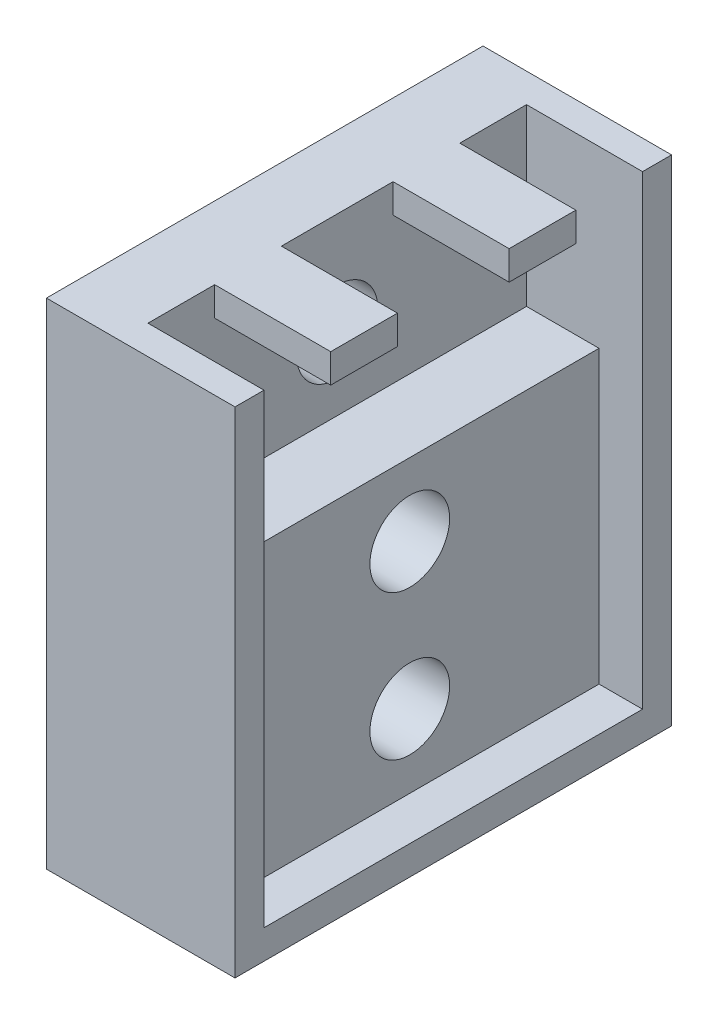
ISO-10303-21;
HEADER;
FILE_DESCRIPTION(('STEP AP214'),'2;1');
FILE_NAME('part.step','',(''),(''),'','','');
FILE_SCHEMA(('AUTOMOTIVE_DESIGN { 1 0 10303 214 1 1 1 1 }'));
ENDSEC;
DATA;
#1=APPLICATION_CONTEXT('core data for automotive mechanical design processes');
#2=APPLICATION_PROTOCOL_DEFINITION('international standard','automotive_design',2000,#1);
#3=PRODUCT_CONTEXT('',#1,'mechanical');
#4=PRODUCT('Part','Part','',(#3));
#5=PRODUCT_RELATED_PRODUCT_CATEGORY('part','',(#4));
#6=PRODUCT_DEFINITION_FORMATION('','',#4);
#7=PRODUCT_DEFINITION_CONTEXT('part definition',#1,'design');
#8=PRODUCT_DEFINITION('design','',#6,#7);
#9=PRODUCT_DEFINITION_SHAPE('','',#8);
#10=(LENGTH_UNIT() NAMED_UNIT(*) SI_UNIT(.MILLI.,.METRE.));
#11=(NAMED_UNIT(*) PLANE_ANGLE_UNIT() SI_UNIT($,.RADIAN.));
#12=(NAMED_UNIT(*) SI_UNIT($,.STERADIAN.) SOLID_ANGLE_UNIT());
#13=UNCERTAINTY_MEASURE_WITH_UNIT(LENGTH_MEASURE(1.E-05),#10,'distance_accuracy_value','');
#14=(GEOMETRIC_REPRESENTATION_CONTEXT(3) GLOBAL_UNCERTAINTY_ASSIGNED_CONTEXT((#13)) GLOBAL_UNIT_ASSIGNED_CONTEXT((#10,
#11,#12)) REPRESENTATION_CONTEXT('',''));
#15=CARTESIAN_POINT('',(0.,0.,0.));
#16=DIRECTION('',(0.,0.,1.));
#17=DIRECTION('',(1.,0.,0.));
#18=AXIS2_PLACEMENT_3D('',#15,#16,#17);
#19=CARTESIAN_POINT('',(5.,0.,0.));
#20=DIRECTION('',(1.,0.,0.));
#21=DIRECTION('',(0.,0.,-1.));
#22=AXIS2_PLACEMENT_3D('',#19,#20,#21);
#23=PLANE('',#22);
#24=CARTESIAN_POINT('',(5.,10.,0.));
#25=DIRECTION('',(1.,0.,0.));
#26=DIRECTION('',(0.,0.,-1.));
#27=AXIS2_PLACEMENT_3D('',#24,#25,#26);
#28=CIRCLE('',#27,2.8);
#29=CARTESIAN_POINT('',(5.,10.,-2.79999999999997));
#30=VERTEX_POINT('',#29);
#31=EDGE_CURVE('E824',#30,#30,#28,.T.);
#32=ORIENTED_EDGE('',*,*,#31,.F.);
#33=EDGE_LOOP('',(#32));
#34=FACE_BOUND('',#33,.T.);
#35=DIRECTION('',(0.,-1.,0.));
#36=VECTOR('',#35,1.);
#37=CARTESIAN_POINT('',(5.,0.,13.05));
#38=LINE('',#37,#36);
#39=CARTESIAN_POINT('',(5.,17.05,13.05));
#40=VERTEX_POINT('',#39);
#41=CARTESIAN_POINT('',(5.,5.,13.05));
#42=VERTEX_POINT('',#41);
#43=EDGE_CURVE('E441',#40,#42,#38,.T.);
#44=ORIENTED_EDGE('',*,*,#43,.T.);
#45=DIRECTION('',(0.,0.,1.));
#46=VECTOR('',#45,1.);
#47=CARTESIAN_POINT('',(5.,5.,13.05));
#48=LINE('',#47,#46);
#49=CARTESIAN_POINT('',(5.,5.,-13.05));
#50=VERTEX_POINT('',#49);
#51=EDGE_CURVE('E254',#50,#42,#48,.T.);
#52=ORIENTED_EDGE('',*,*,#51,.F.);
#53=DIRECTION('',(0.,1.,0.));
#54=VECTOR('',#53,1.);
#55=CARTESIAN_POINT('',(5.,0.,-13.05));
#56=LINE('',#55,#54);
#57=CARTESIAN_POINT('',(5.,17.05,-13.05));
#58=VERTEX_POINT('',#57);
#59=EDGE_CURVE('E143',#50,#58,#56,.T.);
#60=ORIENTED_EDGE('',*,*,#59,.T.);
#61=DIRECTION('',(0.,0.,-1.));
#62=VECTOR('',#61,1.);
#63=CARTESIAN_POINT('',(5.,17.05,0.));
#64=LINE('',#63,#62);
#65=CARTESIAN_POINT('',(5.,17.05,-8.44999999999999));
#66=VERTEX_POINT('',#65);
#67=EDGE_CURVE('E364',#66,#58,#64,.T.);
#68=ORIENTED_EDGE('',*,*,#67,.F.);
#69=DIRECTION('',(0.,-1.,0.));
#70=VECTOR('',#69,1.);
#71=CARTESIAN_POINT('',(5.,0.,-8.44999999999999));
#72=LINE('',#71,#70);
#73=CARTESIAN_POINT('',(5.,15.05,-8.44999999999999));
#74=VERTEX_POINT('',#73);
#75=EDGE_CURVE('E323',#66,#74,#72,.T.);
#76=ORIENTED_EDGE('',*,*,#75,.T.);
#77=DIRECTION('',(0.,0.,-1.));
#78=VECTOR('',#77,1.);
#79=CARTESIAN_POINT('',(5.,15.05,0.));
#80=LINE('',#79,#78);
#81=CARTESIAN_POINT('',(5.,15.05,-3.84999999999999));
#82=VERTEX_POINT('',#81);
#83=EDGE_CURVE('E337',#82,#74,#80,.T.);
#84=ORIENTED_EDGE('',*,*,#83,.F.);
#85=DIRECTION('',(0.,-1.,0.));
#86=VECTOR('',#85,1.);
#87=CARTESIAN_POINT('',(5.,0.,-3.85));
#88=LINE('',#87,#86);
#89=CARTESIAN_POINT('',(5.,17.05,-3.84999999999999));
#90=VERTEX_POINT('',#89);
#91=EDGE_CURVE('E317',#90,#82,#88,.T.);
#92=ORIENTED_EDGE('',*,*,#91,.F.);
#93=CARTESIAN_POINT('',(5.,17.05,3.85));
#94=VERTEX_POINT('',#93);
#95=EDGE_CURVE('E363',#94,#90,#64,.T.);
#96=ORIENTED_EDGE('',*,*,#95,.F.);
#97=DIRECTION('',(0.,-1.,0.));
#98=VECTOR('',#97,1.);
#99=CARTESIAN_POINT('',(5.,0.,3.85));
#100=LINE('',#99,#98);
#101=CARTESIAN_POINT('',(5.,15.05,3.85));
#102=VERTEX_POINT('',#101);
#103=EDGE_CURVE('E271',#94,#102,#100,.T.);
#104=ORIENTED_EDGE('',*,*,#103,.T.);
#105=DIRECTION('',(0.,0.,-1.));
#106=VECTOR('',#105,1.);
#107=CARTESIAN_POINT('',(5.,15.05,0.));
#108=LINE('',#107,#106);
#109=CARTESIAN_POINT('',(5.,15.05,8.45));
#110=VERTEX_POINT('',#109);
#111=EDGE_CURVE('E289',#110,#102,#108,.T.);
#112=ORIENTED_EDGE('',*,*,#111,.F.);
#113=DIRECTION('',(0.,-1.,0.));
#114=VECTOR('',#113,1.);
#115=CARTESIAN_POINT('',(5.,0.,8.45));
#116=LINE('',#115,#114);
#117=CARTESIAN_POINT('',(5.,17.05,8.45));
#118=VERTEX_POINT('',#117);
#119=EDGE_CURVE('E277',#118,#110,#116,.T.);
#120=ORIENTED_EDGE('',*,*,#119,.F.);
#121=EDGE_CURVE('E359',#40,#118,#64,.T.);
#122=ORIENTED_EDGE('',*,*,#121,.F.);
#123=EDGE_LOOP('',(#44,#52,#60,#68,#76,#84,#92,#96,#104,#112,#120,#122));
#124=FACE_BOUND('',#123,.T.);
#125=ADVANCED_FACE('F117',(#34,#124),#23,.T.);
#126=CARTESIAN_POINT('',(0.,10.,0.));
#127=DIRECTION('',(1.,0.,0.));
#128=DIRECTION('',(0.,0.,-1.));
#129=AXIS2_PLACEMENT_3D('',#126,#127,#128);
#130=CYLINDRICAL_SURFACE('',#129,1.7);
#131=CARTESIAN_POINT('',(0.,10.,0.));
#132=DIRECTION('',(1.,0.,0.));
#133=DIRECTION('',(0.,0.,-1.));
#134=AXIS2_PLACEMENT_3D('',#131,#132,#133);
#135=CIRCLE('',#134,1.7);
#136=CARTESIAN_POINT('',(0.,10.,-1.69999999999997));
#137=VERTEX_POINT('',#136);
#138=EDGE_CURVE('E398',#137,#137,#135,.T.);
#139=ORIENTED_EDGE('',*,*,#138,.F.);
#140=EDGE_LOOP('',(#139));
#141=FACE_BOUND('',#140,.T.);
#142=CARTESIAN_POINT('',(2.,10.,0.));
#143=DIRECTION('',(1.,0.,0.));
#144=DIRECTION('',(0.,0.,-1.));
#145=AXIS2_PLACEMENT_3D('',#142,#143,#144);
#146=CIRCLE('',#145,1.7);
#147=CARTESIAN_POINT('',(2.,10.,-1.69999999999997));
#148=VERTEX_POINT('',#147);
#149=EDGE_CURVE('E121',#148,#148,#146,.F.);
#150=ORIENTED_EDGE('',*,*,#149,.F.);
#151=EDGE_LOOP('',(#150));
#152=FACE_BOUND('',#151,.T.);
#153=ADVANCED_FACE('F490',(#141,#152),#130,.F.);
#154=CARTESIAN_POINT('',(0.,0.,0.));
#155=DIRECTION('',(1.,0.,0.));
#156=DIRECTION('',(0.,0.,-1.));
#157=AXIS2_PLACEMENT_3D('',#154,#155,#156);
#158=CYLINDRICAL_SURFACE('',#157,1.7);
#159=CARTESIAN_POINT('',(0.,0.,0.));
#160=DIRECTION('',(1.,0.,0.));
#161=DIRECTION('',(0.,0.,-1.));
#162=AXIS2_PLACEMENT_3D('',#159,#160,#161);
#163=CIRCLE('',#162,1.7);
#164=CARTESIAN_POINT('',(0.,0.,-1.7));
#165=VERTEX_POINT('',#164);
#166=EDGE_CURVE('E403',#165,#165,#163,.T.);
#167=ORIENTED_EDGE('',*,*,#166,.F.);
#168=EDGE_LOOP('',(#167));
#169=FACE_BOUND('',#168,.T.);
#170=CARTESIAN_POINT('',(2.,0.,0.));
#171=DIRECTION('',(1.,0.,0.));
#172=DIRECTION('',(0.,0.,-1.));
#173=AXIS2_PLACEMENT_3D('',#170,#171,#172);
#174=CIRCLE('',#173,1.7);
#175=CARTESIAN_POINT('',(2.,0.,-1.7));
#176=VERTEX_POINT('',#175);
#177=EDGE_CURVE('E390',#176,#176,#174,.F.);
#178=ORIENTED_EDGE('',*,*,#177,.F.);
#179=EDGE_LOOP('',(#178));
#180=FACE_BOUND('',#179,.T.);
#181=ADVANCED_FACE('F498',(#169,#180),#158,.F.);
#182=CARTESIAN_POINT('',(0.,-10.,0.));
#183=DIRECTION('',(1.,0.,0.));
#184=DIRECTION('',(0.,0.,-1.));
#185=AXIS2_PLACEMENT_3D('',#182,#183,#184);
#186=CYLINDRICAL_SURFACE('',#185,1.7);
#187=CARTESIAN_POINT('',(0.,-10.,0.));
#188=DIRECTION('',(1.,0.,0.));
#189=DIRECTION('',(0.,0.,-1.));
#190=AXIS2_PLACEMENT_3D('',#187,#188,#189);
#191=CIRCLE('',#190,1.7);
#192=CARTESIAN_POINT('',(0.,-10.,-1.70000000000003));
#193=VERTEX_POINT('',#192);
#194=EDGE_CURVE('E409',#193,#193,#191,.T.);
#195=ORIENTED_EDGE('',*,*,#194,.F.);
#196=EDGE_LOOP('',(#195));
#197=FACE_BOUND('',#196,.T.);
#198=CARTESIAN_POINT('',(2.,-10.,0.));
#199=DIRECTION('',(1.,0.,0.));
#200=DIRECTION('',(0.,0.,-1.));
#201=AXIS2_PLACEMENT_3D('',#198,#199,#200);
#202=CIRCLE('',#201,1.7);
#203=CARTESIAN_POINT('',(2.,-10.,-1.70000000000003));
#204=VERTEX_POINT('',#203);
#205=EDGE_CURVE('E387',#204,#204,#202,.F.);
#206=ORIENTED_EDGE('',*,*,#205,.F.);
#207=EDGE_LOOP('',(#206));
#208=FACE_BOUND('',#207,.T.);
#209=ADVANCED_FACE('F517',(#197,#208),#186,.F.);
#210=CARTESIAN_POINT('',(5.,0.,15.05));
#211=DIRECTION('',(0.,0.,1.));
#212=DIRECTION('',(1.,0.,0.));
#213=AXIS2_PLACEMENT_3D('',#210,#211,#212);
#214=PLANE('',#213);
#215=DIRECTION('',(0.,1.,0.));
#216=VECTOR('',#215,1.);
#217=CARTESIAN_POINT('',(0.,0.,15.05));
#218=LINE('',#217,#216);
#219=CARTESIAN_POINT('',(0.,-17.05,15.05));
#220=VERTEX_POINT('',#219);
#221=CARTESIAN_POINT('',(0.,17.05,15.05));
#222=VERTEX_POINT('',#221);
#223=EDGE_CURVE('E358',#220,#222,#218,.T.);
#224=ORIENTED_EDGE('',*,*,#223,.F.);
#225=DIRECTION('',(-1.,0.,0.));
#226=VECTOR('',#225,1.);
#227=CARTESIAN_POINT('',(5.,-17.05,15.05));
#228=LINE('',#227,#226);
#229=CARTESIAN_POINT('',(13.,-17.05,15.05));
#230=VERTEX_POINT('',#229);
#231=EDGE_CURVE('E12',#230,#220,#228,.T.);
#232=ORIENTED_EDGE('',*,*,#231,.F.);
#233=DIRECTION('',(0.,-1.,0.));
#234=VECTOR('',#233,1.);
#235=CARTESIAN_POINT('',(13.,0.,15.05));
#236=LINE('',#235,#234);
#237=CARTESIAN_POINT('',(13.,17.05,15.05));
#238=VERTEX_POINT('',#237);
#239=EDGE_CURVE('E422',#238,#230,#236,.T.);
#240=ORIENTED_EDGE('',*,*,#239,.F.);
#241=DIRECTION('',(-1.,0.,0.));
#242=VECTOR('',#241,1.);
#243=CARTESIAN_POINT('',(5.,17.05,15.05));
#244=LINE('',#243,#242);
#245=EDGE_CURVE('E362',#238,#222,#244,.T.);
#246=ORIENTED_EDGE('',*,*,#245,.T.);
#247=EDGE_LOOP('',(#224,#232,#240,#246));
#248=FACE_BOUND('',#247,.T.);
#249=ADVANCED_FACE('F119',(#248),#214,.T.);
#250=CARTESIAN_POINT('',(5.,-17.05,0.));
#251=DIRECTION('',(0.,1.,0.));
#252=DIRECTION('',(0.,0.,1.));
#253=AXIS2_PLACEMENT_3D('',#250,#251,#252);
#254=PLANE('',#253);
#255=DIRECTION('',(0.,0.,-1.));
#256=VECTOR('',#255,1.);
#257=CARTESIAN_POINT('',(0.,-17.05,0.));
#258=LINE('',#257,#256);
#259=CARTESIAN_POINT('',(0.,-17.05,-15.05));
#260=VERTEX_POINT('',#259);
#261=EDGE_CURVE('E368',#220,#260,#258,.T.);
#262=ORIENTED_EDGE('',*,*,#261,.T.);
#263=DIRECTION('',(-1.,0.,0.));
#264=VECTOR('',#263,1.);
#265=CARTESIAN_POINT('',(5.,-17.05,-15.05));
#266=LINE('',#265,#264);
#267=CARTESIAN_POINT('',(13.,-17.05,-15.05));
#268=VERTEX_POINT('',#267);
#269=EDGE_CURVE('E127',#268,#260,#266,.T.);
#270=ORIENTED_EDGE('',*,*,#269,.F.);
#271=DIRECTION('',(0.,0.,-1.));
#272=VECTOR('',#271,1.);
#273=CARTESIAN_POINT('',(13.,-17.05,0.));
#274=LINE('',#273,#272);
#275=EDGE_CURVE('E426',#230,#268,#274,.T.);
#276=ORIENTED_EDGE('',*,*,#275,.F.);
#277=ORIENTED_EDGE('',*,*,#231,.T.);
#278=EDGE_LOOP('',(#262,#270,#276,#277));
#279=FACE_BOUND('',#278,.T.);
#280=ADVANCED_FACE('F510',(#279),#254,.F.);
#281=CARTESIAN_POINT('',(5.,0.,-15.05));
#282=DIRECTION('',(0.,0.,1.));
#283=DIRECTION('',(0.,-1.,0.));
#284=AXIS2_PLACEMENT_3D('',#281,#282,#283);
#285=PLANE('',#284);
#286=DIRECTION('',(0.,1.,0.));
#287=VECTOR('',#286,1.);
#288=CARTESIAN_POINT('',(0.,0.,-15.05));
#289=LINE('',#288,#287);
#290=CARTESIAN_POINT('',(0.,17.05,-15.05));
#291=VERTEX_POINT('',#290);
#292=EDGE_CURVE('E371',#260,#291,#289,.T.);
#293=ORIENTED_EDGE('',*,*,#292,.T.);
#294=DIRECTION('',(-1.,0.,0.));
#295=VECTOR('',#294,1.);
#296=CARTESIAN_POINT('',(5.,17.05,-15.05));
#297=LINE('',#296,#295);
#298=CARTESIAN_POINT('',(13.,17.05,-15.05));
#299=VERTEX_POINT('',#298);
#300=EDGE_CURVE('E381',#299,#291,#297,.T.);
#301=ORIENTED_EDGE('',*,*,#300,.F.);
#302=DIRECTION('',(0.,1.,0.));
#303=VECTOR('',#302,1.);
#304=CARTESIAN_POINT('',(13.,0.,-15.05));
#305=LINE('',#304,#303);
#306=EDGE_CURVE('E430',#268,#299,#305,.T.);
#307=ORIENTED_EDGE('',*,*,#306,.F.);
#308=ORIENTED_EDGE('',*,*,#269,.T.);
#309=EDGE_LOOP('',(#293,#301,#307,#308));
#310=FACE_BOUND('',#309,.T.);
#311=ADVANCED_FACE('F508',(#310),#285,.F.);
#312=CARTESIAN_POINT('',(5.,17.05,0.));
#313=DIRECTION('',(0.,1.,0.));
#314=DIRECTION('',(0.,0.,1.));
#315=AXIS2_PLACEMENT_3D('',#312,#313,#314);
#316=PLANE('',#315);
#317=DIRECTION('',(0.,0.,-1.));
#318=VECTOR('',#317,1.);
#319=CARTESIAN_POINT('',(0.,17.05,0.));
#320=LINE('',#319,#318);
#321=EDGE_CURVE('E375',#222,#291,#320,.T.);
#322=ORIENTED_EDGE('',*,*,#321,.F.);
#323=ORIENTED_EDGE('',*,*,#245,.F.);
#324=DIRECTION('',(0.,0.,1.));
#325=VECTOR('',#324,1.);
#326=CARTESIAN_POINT('',(13.,17.05,0.));
#327=LINE('',#326,#325);
#328=CARTESIAN_POINT('',(13.,17.05,13.05));
#329=VERTEX_POINT('',#328);
#330=EDGE_CURVE('E418',#329,#238,#327,.T.);
#331=ORIENTED_EDGE('',*,*,#330,.F.);
#332=DIRECTION('',(-1.,0.,0.));
#333=VECTOR('',#332,1.);
#334=CARTESIAN_POINT('',(13.,17.05,13.05));
#335=LINE('',#334,#333);
#336=EDGE_CURVE('E272',#329,#40,#335,.T.);
#337=ORIENTED_EDGE('',*,*,#336,.T.);
#338=ORIENTED_EDGE('',*,*,#121,.T.);
#339=DIRECTION('',(-1.,0.,0.));
#340=VECTOR('',#339,1.);
#341=CARTESIAN_POINT('',(13.,17.05,8.45));
#342=LINE('',#341,#340);
#343=CARTESIAN_POINT('',(13.,17.05,8.45));
#344=VERTEX_POINT('',#343);
#345=EDGE_CURVE('E310',#344,#118,#342,.T.);
#346=ORIENTED_EDGE('',*,*,#345,.F.);
#347=DIRECTION('',(0.,0.,1.));
#348=VECTOR('',#347,1.);
#349=CARTESIAN_POINT('',(13.,17.05,0.));
#350=LINE('',#349,#348);
#351=CARTESIAN_POINT('',(13.,17.05,3.85));
#352=VERTEX_POINT('',#351);
#353=EDGE_CURVE('E288',#352,#344,#350,.T.);
#354=ORIENTED_EDGE('',*,*,#353,.F.);
#355=DIRECTION('',(-1.,0.,0.));
#356=VECTOR('',#355,1.);
#357=CARTESIAN_POINT('',(13.,17.05,3.85));
#358=LINE('',#357,#356);
#359=EDGE_CURVE('E314',#352,#94,#358,.T.);
#360=ORIENTED_EDGE('',*,*,#359,.T.);
#361=ORIENTED_EDGE('',*,*,#95,.T.);
#362=DIRECTION('',(-1.,0.,0.));
#363=VECTOR('',#362,1.);
#364=CARTESIAN_POINT('',(13.,17.05,-3.84999999999999));
#365=LINE('',#364,#363);
#366=CARTESIAN_POINT('',(13.,17.05,-3.84999999999999));
#367=VERTEX_POINT('',#366);
#368=EDGE_CURVE('E333',#367,#90,#365,.T.);
#369=ORIENTED_EDGE('',*,*,#368,.F.);
#370=DIRECTION('',(0.,0.,1.));
#371=VECTOR('',#370,1.);
#372=CARTESIAN_POINT('',(13.,17.05,0.));
#373=LINE('',#372,#371);
#374=CARTESIAN_POINT('',(13.,17.05,-8.44999999999999));
#375=VERTEX_POINT('',#374);
#376=EDGE_CURVE('E330',#375,#367,#373,.T.);
#377=ORIENTED_EDGE('',*,*,#376,.F.);
#378=DIRECTION('',(-1.,0.,0.));
#379=VECTOR('',#378,1.);
#380=CARTESIAN_POINT('',(13.,17.05,-8.44999999999999));
#381=LINE('',#380,#379);
#382=EDGE_CURVE('E346',#375,#66,#381,.T.);
#383=ORIENTED_EDGE('',*,*,#382,.T.);
#384=ORIENTED_EDGE('',*,*,#67,.T.);
#385=DIRECTION('',(-1.,0.,0.));
#386=VECTOR('',#385,1.);
#387=CARTESIAN_POINT('',(13.,17.05,-13.05));
#388=LINE('',#387,#386);
#389=CARTESIAN_POINT('',(13.,17.05,-13.05));
#390=VERTEX_POINT('',#389);
#391=EDGE_CURVE('E280',#390,#58,#388,.T.);
#392=ORIENTED_EDGE('',*,*,#391,.F.);
#393=DIRECTION('',(0.,0.,1.));
#394=VECTOR('',#393,1.);
#395=CARTESIAN_POINT('',(13.,17.05,0.));
#396=LINE('',#395,#394);
#397=EDGE_CURVE('E434',#299,#390,#396,.T.);
#398=ORIENTED_EDGE('',*,*,#397,.F.);
#399=ORIENTED_EDGE('',*,*,#300,.T.);
#400=EDGE_LOOP('',(#322,#323,#331,#337,#338,#346,#354,#360,#361,#369,#377,#383,#384,#392,#398,#399));
#401=FACE_BOUND('',#400,.T.);
#402=ADVANCED_FACE('F458',(#401),#316,.T.);
#403=CARTESIAN_POINT('',(0.,0.,0.));
#404=DIRECTION('',(1.,0.,0.));
#405=DIRECTION('',(0.,0.,-1.));
#406=AXIS2_PLACEMENT_3D('',#403,#404,#405);
#407=PLANE('',#406);
#408=ORIENTED_EDGE('',*,*,#194,.T.);
#409=EDGE_LOOP('',(#408));
#410=FACE_BOUND('',#409,.T.);
#411=ORIENTED_EDGE('',*,*,#166,.T.);
#412=EDGE_LOOP('',(#411));
#413=FACE_BOUND('',#412,.T.);
#414=ORIENTED_EDGE('',*,*,#138,.T.);
#415=EDGE_LOOP('',(#414));
#416=FACE_BOUND('',#415,.T.);
#417=ORIENTED_EDGE('',*,*,#223,.T.);
#418=ORIENTED_EDGE('',*,*,#321,.T.);
#419=ORIENTED_EDGE('',*,*,#292,.F.);
#420=ORIENTED_EDGE('',*,*,#261,.F.);
#421=EDGE_LOOP('',(#417,#418,#419,#420));
#422=FACE_BOUND('',#421,.T.);
#423=ADVANCED_FACE('F487',(#410,#413,#416,#422),#407,.F.);
#424=CARTESIAN_POINT('',(13.,0.,-3.85));
#425=DIRECTION('',(0.,0.,-1.));
#426=DIRECTION('',(0.,1.,0.));
#427=AXIS2_PLACEMENT_3D('',#424,#425,#426);
#428=PLANE('',#427);
#429=ORIENTED_EDGE('',*,*,#91,.T.);
#430=DIRECTION('',(-1.,0.,0.));
#431=VECTOR('',#430,1.);
#432=CARTESIAN_POINT('',(13.,15.05,-3.84999999999999));
#433=LINE('',#432,#431);
#434=CARTESIAN_POINT('',(13.,15.05,-3.84999999999999));
#435=VERTEX_POINT('',#434);
#436=EDGE_CURVE('E354',#435,#82,#433,.T.);
#437=ORIENTED_EDGE('',*,*,#436,.F.);
#438=DIRECTION('',(0.,-1.,0.));
#439=VECTOR('',#438,1.);
#440=CARTESIAN_POINT('',(13.,0.,-3.85));
#441=LINE('',#440,#439);
#442=EDGE_CURVE('E318',#367,#435,#441,.T.);
#443=ORIENTED_EDGE('',*,*,#442,.F.);
#444=ORIENTED_EDGE('',*,*,#368,.T.);
#445=EDGE_LOOP('',(#429,#437,#443,#444));
#446=FACE_BOUND('',#445,.T.);
#447=ADVANCED_FACE('F471',(#446),#428,.F.);
#448=CARTESIAN_POINT('',(13.,15.05,0.));
#449=DIRECTION('',(0.,1.,0.));
#450=DIRECTION('',(0.,0.,1.));
#451=AXIS2_PLACEMENT_3D('',#448,#449,#450);
#452=PLANE('',#451);
#453=ORIENTED_EDGE('',*,*,#83,.T.);
#454=DIRECTION('',(-1.,0.,0.));
#455=VECTOR('',#454,1.);
#456=CARTESIAN_POINT('',(13.,15.05,-8.44999999999999));
#457=LINE('',#456,#455);
#458=CARTESIAN_POINT('',(13.,15.05,-8.44999999999999));
#459=VERTEX_POINT('',#458);
#460=EDGE_CURVE('E350',#459,#74,#457,.T.);
#461=ORIENTED_EDGE('',*,*,#460,.F.);
#462=DIRECTION('',(0.,0.,-1.));
#463=VECTOR('',#462,1.);
#464=CARTESIAN_POINT('',(13.,15.05,0.));
#465=LINE('',#464,#463);
#466=EDGE_CURVE('E322',#435,#459,#465,.T.);
#467=ORIENTED_EDGE('',*,*,#466,.F.);
#468=ORIENTED_EDGE('',*,*,#436,.T.);
#469=EDGE_LOOP('',(#453,#461,#467,#468));
#470=FACE_BOUND('',#469,.T.);
#471=ADVANCED_FACE('F479',(#470),#452,.F.);
#472=CARTESIAN_POINT('',(13.,0.,-8.44999999999999));
#473=DIRECTION('',(0.,0.,-1.));
#474=DIRECTION('',(-1.,0.,0.));
#475=AXIS2_PLACEMENT_3D('',#472,#473,#474);
#476=PLANE('',#475);
#477=ORIENTED_EDGE('',*,*,#75,.F.);
#478=ORIENTED_EDGE('',*,*,#382,.F.);
#479=DIRECTION('',(0.,-1.,0.));
#480=VECTOR('',#479,1.);
#481=CARTESIAN_POINT('',(13.,0.,-8.44999999999999));
#482=LINE('',#481,#480);
#483=EDGE_CURVE('E326',#375,#459,#482,.T.);
#484=ORIENTED_EDGE('',*,*,#483,.T.);
#485=ORIENTED_EDGE('',*,*,#460,.T.);
#486=EDGE_LOOP('',(#477,#478,#484,#485));
#487=FACE_BOUND('',#486,.T.);
#488=ADVANCED_FACE('F477',(#487),#476,.T.);
#489=CARTESIAN_POINT('',(13.,0.,0.));
#490=DIRECTION('',(1.,0.,0.));
#491=DIRECTION('',(0.,0.,-1.));
#492=AXIS2_PLACEMENT_3D('',#489,#490,#491);
#493=PLANE('',#492);
#494=ORIENTED_EDGE('',*,*,#442,.T.);
#495=ORIENTED_EDGE('',*,*,#466,.T.);
#496=ORIENTED_EDGE('',*,*,#483,.F.);
#497=ORIENTED_EDGE('',*,*,#376,.T.);
#498=EDGE_LOOP('',(#494,#495,#496,#497));
#499=FACE_BOUND('',#498,.T.);
#500=ADVANCED_FACE('F473',(#499),#493,.T.);
#501=CARTESIAN_POINT('',(13.,0.,3.85));
#502=DIRECTION('',(0.,0.,-1.));
#503=DIRECTION('',(0.,1.,0.));
#504=AXIS2_PLACEMENT_3D('',#501,#502,#503);
#505=PLANE('',#504);
#506=ORIENTED_EDGE('',*,*,#103,.F.);
#507=ORIENTED_EDGE('',*,*,#359,.F.);
#508=DIRECTION('',(0.,-1.,0.));
#509=VECTOR('',#508,1.);
#510=CARTESIAN_POINT('',(13.,0.,3.85));
#511=LINE('',#510,#509);
#512=CARTESIAN_POINT('',(13.,15.05,3.85));
#513=VERTEX_POINT('',#512);
#514=EDGE_CURVE('E284',#352,#513,#511,.T.);
#515=ORIENTED_EDGE('',*,*,#514,.T.);
#516=DIRECTION('',(-1.,0.,0.));
#517=VECTOR('',#516,1.);
#518=CARTESIAN_POINT('',(13.,15.05,3.85));
#519=LINE('',#518,#517);
#520=EDGE_CURVE('E297',#513,#102,#519,.T.);
#521=ORIENTED_EDGE('',*,*,#520,.T.);
#522=EDGE_LOOP('',(#506,#507,#515,#521));
#523=FACE_BOUND('',#522,.T.);
#524=ADVANCED_FACE('F544',(#523),#505,.T.);
#525=CARTESIAN_POINT('',(13.,0.,8.45));
#526=DIRECTION('',(0.,0.,-1.));
#527=DIRECTION('',(-1.,0.,0.));
#528=AXIS2_PLACEMENT_3D('',#525,#526,#527);
#529=PLANE('',#528);
#530=ORIENTED_EDGE('',*,*,#119,.T.);
#531=DIRECTION('',(-1.,0.,0.));
#532=VECTOR('',#531,1.);
#533=CARTESIAN_POINT('',(13.,15.05,8.45));
#534=LINE('',#533,#532);
#535=CARTESIAN_POINT('',(13.,15.05,8.45));
#536=VERTEX_POINT('',#535);
#537=EDGE_CURVE('E307',#536,#110,#534,.T.);
#538=ORIENTED_EDGE('',*,*,#537,.F.);
#539=DIRECTION('',(0.,-1.,0.));
#540=VECTOR('',#539,1.);
#541=CARTESIAN_POINT('',(13.,0.,8.45));
#542=LINE('',#541,#540);
#543=EDGE_CURVE('E292',#344,#536,#542,.T.);
#544=ORIENTED_EDGE('',*,*,#543,.F.);
#545=ORIENTED_EDGE('',*,*,#345,.T.);
#546=EDGE_LOOP('',(#530,#538,#544,#545));
#547=FACE_BOUND('',#546,.T.);
#548=ADVANCED_FACE('F536',(#547),#529,.F.);
#549=CARTESIAN_POINT('',(13.,15.05,0.));
#550=DIRECTION('',(0.,1.,0.));
#551=DIRECTION('',(0.,0.,1.));
#552=AXIS2_PLACEMENT_3D('',#549,#550,#551);
#553=PLANE('',#552);
#554=ORIENTED_EDGE('',*,*,#111,.T.);
#555=ORIENTED_EDGE('',*,*,#520,.F.);
#556=DIRECTION('',(0.,0.,-1.));
#557=VECTOR('',#556,1.);
#558=CARTESIAN_POINT('',(13.,15.05,0.));
#559=LINE('',#558,#557);
#560=EDGE_CURVE('E295',#536,#513,#559,.T.);
#561=ORIENTED_EDGE('',*,*,#560,.F.);
#562=ORIENTED_EDGE('',*,*,#537,.T.);
#563=EDGE_LOOP('',(#554,#555,#561,#562));
#564=FACE_BOUND('',#563,.T.);
#565=ADVANCED_FACE('F546',(#564),#553,.F.);
#566=CARTESIAN_POINT('',(13.,0.,0.));
#567=DIRECTION('',(1.,0.,0.));
#568=DIRECTION('',(0.,0.,-1.));
#569=AXIS2_PLACEMENT_3D('',#566,#567,#568);
#570=PLANE('',#569);
#571=ORIENTED_EDGE('',*,*,#514,.F.);
#572=ORIENTED_EDGE('',*,*,#353,.T.);
#573=ORIENTED_EDGE('',*,*,#543,.T.);
#574=ORIENTED_EDGE('',*,*,#560,.T.);
#575=EDGE_LOOP('',(#571,#572,#573,#574));
#576=FACE_BOUND('',#575,.T.);
#577=ADVANCED_FACE('F541',(#576),#570,.T.);
#578=CARTESIAN_POINT('',(13.,-15.05,0.));
#579=DIRECTION('',(0.,1.,0.));
#580=DIRECTION('',(0.,0.,1.));
#581=AXIS2_PLACEMENT_3D('',#578,#579,#580);
#582=PLANE('',#581);
#583=DIRECTION('',(0.,0.,-1.));
#584=VECTOR('',#583,1.);
#585=CARTESIAN_POINT('',(10.,-15.05,13.05));
#586=LINE('',#585,#584);
#587=CARTESIAN_POINT('',(10.,-15.05,13.05));
#588=VERTEX_POINT('',#587);
#589=CARTESIAN_POINT('',(10.,-15.05,-13.05));
#590=VERTEX_POINT('',#589);
#591=EDGE_CURVE('E248',#588,#590,#586,.T.);
#592=ORIENTED_EDGE('',*,*,#591,.F.);
#593=DIRECTION('',(-1.,0.,0.));
#594=VECTOR('',#593,1.);
#595=CARTESIAN_POINT('',(13.,-15.05,13.05));
#596=LINE('',#595,#594);
#597=CARTESIAN_POINT('',(13.,-15.05,13.05));
#598=VERTEX_POINT('',#597);
#599=EDGE_CURVE('E260',#598,#588,#596,.T.);
#600=ORIENTED_EDGE('',*,*,#599,.F.);
#601=DIRECTION('',(0.,0.,-1.));
#602=VECTOR('',#601,1.);
#603=CARTESIAN_POINT('',(13.,-15.05,0.));
#604=LINE('',#603,#602);
#605=CARTESIAN_POINT('',(13.,-15.05,-13.05));
#606=VERTEX_POINT('',#605);
#607=EDGE_CURVE('E413',#598,#606,#604,.T.);
#608=ORIENTED_EDGE('',*,*,#607,.T.);
#609=DIRECTION('',(-1.,0.,0.));
#610=VECTOR('',#609,1.);
#611=CARTESIAN_POINT('',(13.,-15.05,-13.05));
#612=LINE('',#611,#610);
#613=EDGE_CURVE('E262',#606,#590,#612,.T.);
#614=ORIENTED_EDGE('',*,*,#613,.T.);
#615=EDGE_LOOP('',(#592,#600,#608,#614));
#616=FACE_BOUND('',#615,.T.);
#617=ADVANCED_FACE('F258',(#616),#582,.T.);
#618=CARTESIAN_POINT('',(13.,0.,13.05));
#619=DIRECTION('',(0.,0.,-1.));
#620=DIRECTION('',(-1.,0.,0.));
#621=AXIS2_PLACEMENT_3D('',#618,#619,#620);
#622=PLANE('',#621);
#623=DIRECTION('',(0.,-1.,0.));
#624=VECTOR('',#623,1.);
#625=CARTESIAN_POINT('',(10.,5.,13.05));
#626=LINE('',#625,#624);
#627=CARTESIAN_POINT('',(10.,5.,13.05));
#628=VERTEX_POINT('',#627);
#629=EDGE_CURVE('E244',#628,#588,#626,.T.);
#630=ORIENTED_EDGE('',*,*,#629,.F.);
#631=DIRECTION('',(-1.,0.,0.));
#632=VECTOR('',#631,1.);
#633=CARTESIAN_POINT('',(10.,5.,13.05));
#634=LINE('',#633,#632);
#635=EDGE_CURVE('E531',#628,#42,#634,.T.);
#636=ORIENTED_EDGE('',*,*,#635,.T.);
#637=ORIENTED_EDGE('',*,*,#43,.F.);
#638=ORIENTED_EDGE('',*,*,#336,.F.);
#639=DIRECTION('',(0.,-1.,0.));
#640=VECTOR('',#639,1.);
#641=CARTESIAN_POINT('',(13.,0.,13.05));
#642=LINE('',#641,#640);
#643=EDGE_CURVE('E269',#329,#598,#642,.T.);
#644=ORIENTED_EDGE('',*,*,#643,.T.);
#645=ORIENTED_EDGE('',*,*,#599,.T.);
#646=EDGE_LOOP('',(#630,#636,#637,#638,#644,#645));
#647=FACE_BOUND('',#646,.T.);
#648=ADVANCED_FACE('F267',(#647),#622,.T.);
#649=CARTESIAN_POINT('',(13.,0.,-13.05));
#650=DIRECTION('',(0.,0.,1.));
#651=DIRECTION('',(1.,0.,0.));
#652=AXIS2_PLACEMENT_3D('',#649,#650,#651);
#653=PLANE('',#652);
#654=DIRECTION('',(0.,1.,0.));
#655=VECTOR('',#654,1.);
#656=CARTESIAN_POINT('',(10.,5.,-13.05));
#657=LINE('',#656,#655);
#658=CARTESIAN_POINT('',(10.,5.,-13.05));
#659=VERTEX_POINT('',#658);
#660=EDGE_CURVE('E264',#590,#659,#657,.T.);
#661=ORIENTED_EDGE('',*,*,#660,.F.);
#662=ORIENTED_EDGE('',*,*,#613,.F.);
#663=DIRECTION('',(0.,1.,0.));
#664=VECTOR('',#663,1.);
#665=CARTESIAN_POINT('',(13.,0.,-13.05));
#666=LINE('',#665,#664);
#667=EDGE_CURVE('E437',#606,#390,#666,.T.);
#668=ORIENTED_EDGE('',*,*,#667,.T.);
#669=ORIENTED_EDGE('',*,*,#391,.T.);
#670=ORIENTED_EDGE('',*,*,#59,.F.);
#671=DIRECTION('',(-1.,0.,0.));
#672=VECTOR('',#671,1.);
#673=CARTESIAN_POINT('',(10.,5.,-13.05));
#674=LINE('',#673,#672);
#675=EDGE_CURVE('E805',#659,#50,#674,.T.);
#676=ORIENTED_EDGE('',*,*,#675,.F.);
#677=EDGE_LOOP('',(#661,#662,#668,#669,#670,#676));
#678=FACE_BOUND('',#677,.T.);
#679=ADVANCED_FACE('F452',(#678),#653,.T.);
#680=CARTESIAN_POINT('',(13.,0.,0.));
#681=DIRECTION('',(1.,0.,0.));
#682=DIRECTION('',(0.,0.,-1.));
#683=AXIS2_PLACEMENT_3D('',#680,#681,#682);
#684=PLANE('',#683);
#685=ORIENTED_EDGE('',*,*,#607,.F.);
#686=ORIENTED_EDGE('',*,*,#643,.F.);
#687=ORIENTED_EDGE('',*,*,#330,.T.);
#688=ORIENTED_EDGE('',*,*,#239,.T.);
#689=ORIENTED_EDGE('',*,*,#275,.T.);
#690=ORIENTED_EDGE('',*,*,#306,.T.);
#691=ORIENTED_EDGE('',*,*,#397,.T.);
#692=ORIENTED_EDGE('',*,*,#667,.F.);
#693=EDGE_LOOP('',(#685,#686,#687,#688,#689,#690,#691,#692));
#694=FACE_BOUND('',#693,.T.);
#695=ADVANCED_FACE('F527',(#694),#684,.T.);
#696=CARTESIAN_POINT('',(2.,-10.,0.));
#697=DIRECTION('',(1.,0.,0.));
#698=DIRECTION('',(0.,0.,-1.));
#699=AXIS2_PLACEMENT_3D('',#696,#697,#698);
#700=PLANE('',#699);
#701=CARTESIAN_POINT('',(2.,-10.,0.));
#702=DIRECTION('',(1.,0.,0.));
#703=DIRECTION('',(0.,0.,-1.));
#704=AXIS2_PLACEMENT_3D('',#701,#702,#703);
#705=CIRCLE('',#704,2.8);
#706=CARTESIAN_POINT('',(2.,-10.,-2.80000000000003));
#707=VERTEX_POINT('',#706);
#708=EDGE_CURVE('E391',#707,#707,#705,.T.);
#709=ORIENTED_EDGE('',*,*,#708,.T.);
#710=EDGE_LOOP('',(#709));
#711=FACE_BOUND('',#710,.T.);
#712=ORIENTED_EDGE('',*,*,#205,.T.);
#713=EDGE_LOOP('',(#712));
#714=FACE_BOUND('',#713,.T.);
#715=ADVANCED_FACE('F629',(#711,#714),#700,.T.);
#716=CARTESIAN_POINT('',(2.,-10.,0.));
#717=DIRECTION('',(1.,0.,0.));
#718=DIRECTION('',(0.,0.,-1.));
#719=AXIS2_PLACEMENT_3D('',#716,#717,#718);
#720=CYLINDRICAL_SURFACE('',#719,2.8);
#721=ORIENTED_EDGE('',*,*,#708,.F.);
#722=EDGE_LOOP('',(#721));
#723=FACE_BOUND('',#722,.T.);
#724=CARTESIAN_POINT('',(5.,-10.,0.));
#725=DIRECTION('',(1.,0.,0.));
#726=DIRECTION('',(0.,0.,-1.));
#727=AXIS2_PLACEMENT_3D('',#724,#725,#726);
#728=CIRCLE('',#727,2.8);
#729=CARTESIAN_POINT('',(5.,-10.,-2.80000000000003));
#730=VERTEX_POINT('',#729);
#731=EDGE_CURVE('E812',#730,#730,#728,.F.);
#732=ORIENTED_EDGE('',*,*,#731,.F.);
#733=EDGE_LOOP('',(#732));
#734=FACE_BOUND('',#733,.T.);
#735=ADVANCED_FACE('F665',(#723,#734),#720,.F.);
#736=CARTESIAN_POINT('',(2.,0.,0.));
#737=DIRECTION('',(1.,0.,0.));
#738=DIRECTION('',(0.,0.,-1.));
#739=AXIS2_PLACEMENT_3D('',#736,#737,#738);
#740=PLANE('',#739);
#741=CARTESIAN_POINT('',(2.,0.,0.));
#742=DIRECTION('',(1.,0.,0.));
#743=DIRECTION('',(0.,0.,-1.));
#744=AXIS2_PLACEMENT_3D('',#741,#742,#743);
#745=CIRCLE('',#744,2.8);
#746=CARTESIAN_POINT('',(2.,0.,-2.8));
#747=VERTEX_POINT('',#746);
#748=EDGE_CURVE('E820',#747,#747,#745,.T.);
#749=ORIENTED_EDGE('',*,*,#748,.T.);
#750=EDGE_LOOP('',(#749));
#751=FACE_BOUND('',#750,.T.);
#752=ORIENTED_EDGE('',*,*,#177,.T.);
#753=EDGE_LOOP('',(#752));
#754=FACE_BOUND('',#753,.T.);
#755=ADVANCED_FACE('F675',(#751,#754),#740,.T.);
#756=CARTESIAN_POINT('',(2.,0.,0.));
#757=DIRECTION('',(1.,0.,0.));
#758=DIRECTION('',(0.,0.,-1.));
#759=AXIS2_PLACEMENT_3D('',#756,#757,#758);
#760=CYLINDRICAL_SURFACE('',#759,2.8);
#761=ORIENTED_EDGE('',*,*,#748,.F.);
#762=EDGE_LOOP('',(#761));
#763=FACE_BOUND('',#762,.T.);
#764=CARTESIAN_POINT('',(5.,0.,0.));
#765=DIRECTION('',(1.,0.,0.));
#766=DIRECTION('',(0.,0.,-1.));
#767=AXIS2_PLACEMENT_3D('',#764,#765,#766);
#768=CIRCLE('',#767,2.8);
#769=CARTESIAN_POINT('',(5.,0.,-2.8));
#770=VERTEX_POINT('',#769);
#771=EDGE_CURVE('E808',#770,#770,#768,.F.);
#772=ORIENTED_EDGE('',*,*,#771,.F.);
#773=EDGE_LOOP('',(#772));
#774=FACE_BOUND('',#773,.T.);
#775=ADVANCED_FACE('F685',(#763,#774),#760,.F.);
#776=CARTESIAN_POINT('',(2.,10.,0.));
#777=DIRECTION('',(1.,0.,0.));
#778=DIRECTION('',(0.,0.,-1.));
#779=AXIS2_PLACEMENT_3D('',#776,#777,#778);
#780=PLANE('',#779);
#781=CARTESIAN_POINT('',(2.,10.,0.));
#782=DIRECTION('',(1.,0.,0.));
#783=DIRECTION('',(0.,0.,-1.));
#784=AXIS2_PLACEMENT_3D('',#781,#782,#783);
#785=CIRCLE('',#784,2.8);
#786=CARTESIAN_POINT('',(2.,10.,-2.79999999999997));
#787=VERTEX_POINT('',#786);
#788=EDGE_CURVE('E816',#787,#787,#785,.T.);
#789=ORIENTED_EDGE('',*,*,#788,.T.);
#790=EDGE_LOOP('',(#789));
#791=FACE_BOUND('',#790,.T.);
#792=ORIENTED_EDGE('',*,*,#149,.T.);
#793=EDGE_LOOP('',(#792));
#794=FACE_BOUND('',#793,.T.);
#795=ADVANCED_FACE('F695',(#791,#794),#780,.T.);
#796=CARTESIAN_POINT('',(2.,10.,0.));
#797=DIRECTION('',(1.,0.,0.));
#798=DIRECTION('',(0.,0.,-1.));
#799=AXIS2_PLACEMENT_3D('',#796,#797,#798);
#800=CYLINDRICAL_SURFACE('',#799,2.8);
#801=ORIENTED_EDGE('',*,*,#788,.F.);
#802=EDGE_LOOP('',(#801));
#803=FACE_BOUND('',#802,.T.);
#804=ORIENTED_EDGE('',*,*,#31,.T.);
#805=EDGE_LOOP('',(#804));
#806=FACE_BOUND('',#805,.T.);
#807=ADVANCED_FACE('F705',(#803,#806),#800,.F.);
#808=CARTESIAN_POINT('',(5.,0.,0.));
#809=DIRECTION('',(1.,0.,0.));
#810=DIRECTION('',(0.,0.,-1.));
#811=AXIS2_PLACEMENT_3D('',#808,#809,#810);
#812=PLANE('',#811);
#813=CARTESIAN_POINT('',(5.,-10.,0.));
#814=DIRECTION('',(1.,0.,0.));
#815=DIRECTION('',(0.,0.,-1.));
#816=AXIS2_PLACEMENT_3D('',#813,#814,#815);
#817=CIRCLE('',#816,2.75);
#818=CARTESIAN_POINT('',(5.,-10.,-2.75000000000003));
#819=VERTEX_POINT('',#818);
#820=EDGE_CURVE('E783',#819,#819,#817,.T.);
#821=ORIENTED_EDGE('',*,*,#820,.T.);
#822=EDGE_LOOP('',(#821));
#823=FACE_BOUND('',#822,.T.);
#824=ORIENTED_EDGE('',*,*,#731,.T.);
#825=EDGE_LOOP('',(#824));
#826=FACE_BOUND('',#825,.T.);
#827=ADVANCED_FACE('F714',(#823,#826),#812,.F.);
#828=CARTESIAN_POINT('',(5.,0.,0.));
#829=DIRECTION('',(1.,0.,0.));
#830=DIRECTION('',(0.,0.,-1.));
#831=AXIS2_PLACEMENT_3D('',#828,#829,#830);
#832=CIRCLE('',#831,2.75);
#833=CARTESIAN_POINT('',(5.,0.,-2.75));
#834=VERTEX_POINT('',#833);
#835=EDGE_CURVE('E787',#834,#834,#832,.T.);
#836=ORIENTED_EDGE('',*,*,#835,.T.);
#837=EDGE_LOOP('',(#836));
#838=FACE_BOUND('',#837,.T.);
#839=ORIENTED_EDGE('',*,*,#771,.T.);
#840=EDGE_LOOP('',(#839));
#841=FACE_BOUND('',#840,.T.);
#842=ADVANCED_FACE('F727',(#838,#841),#812,.F.);
#843=CARTESIAN_POINT('',(10.,0.,0.));
#844=DIRECTION('',(1.,0.,0.));
#845=DIRECTION('',(0.,0.,-1.));
#846=AXIS2_PLACEMENT_3D('',#843,#844,#845);
#847=PLANE('',#846);
#848=CARTESIAN_POINT('',(10.,0.,0.));
#849=DIRECTION('',(1.,0.,0.));
#850=DIRECTION('',(0.,0.,-1.));
#851=AXIS2_PLACEMENT_3D('',#848,#849,#850);
#852=CIRCLE('',#851,2.75);
#853=CARTESIAN_POINT('',(10.,0.,-2.75));
#854=VERTEX_POINT('',#853);
#855=EDGE_CURVE('E790',#854,#854,#852,.T.);
#856=ORIENTED_EDGE('',*,*,#855,.F.);
#857=EDGE_LOOP('',(#856));
#858=FACE_BOUND('',#857,.T.);
#859=ORIENTED_EDGE('',*,*,#629,.T.);
#860=ORIENTED_EDGE('',*,*,#591,.T.);
#861=ORIENTED_EDGE('',*,*,#660,.T.);
#862=DIRECTION('',(0.,0.,1.));
#863=VECTOR('',#862,1.);
#864=CARTESIAN_POINT('',(10.,5.,13.05));
#865=LINE('',#864,#863);
#866=EDGE_CURVE('E135',#659,#628,#865,.T.);
#867=ORIENTED_EDGE('',*,*,#866,.T.);
#868=EDGE_LOOP('',(#859,#860,#861,#867));
#869=FACE_BOUND('',#868,.T.);
#870=CARTESIAN_POINT('',(10.,-10.,0.));
#871=DIRECTION('',(1.,0.,0.));
#872=DIRECTION('',(0.,0.,-1.));
#873=AXIS2_PLACEMENT_3D('',#870,#871,#872);
#874=CIRCLE('',#873,2.75);
#875=CARTESIAN_POINT('',(10.,-10.,-2.75000000000003));
#876=VERTEX_POINT('',#875);
#877=EDGE_CURVE('E780',#876,#876,#874,.T.);
#878=ORIENTED_EDGE('',*,*,#877,.F.);
#879=EDGE_LOOP('',(#878));
#880=FACE_BOUND('',#879,.T.);
#881=ADVANCED_FACE('F246',(#858,#869,#880),#847,.T.);
#882=CARTESIAN_POINT('',(10.,5.,13.05));
#883=DIRECTION('',(0.,-1.,0.));
#884=DIRECTION('',(0.,0.,-1.));
#885=AXIS2_PLACEMENT_3D('',#882,#883,#884);
#886=PLANE('',#885);
#887=ORIENTED_EDGE('',*,*,#51,.T.);
#888=ORIENTED_EDGE('',*,*,#635,.F.);
#889=ORIENTED_EDGE('',*,*,#866,.F.);
#890=ORIENTED_EDGE('',*,*,#675,.T.);
#891=EDGE_LOOP('',(#887,#888,#889,#890));
#892=FACE_BOUND('',#891,.T.);
#893=ADVANCED_FACE('F745',(#892),#886,.F.);
#894=CARTESIAN_POINT('',(10.,0.,0.));
#895=DIRECTION('',(-1.,0.,0.));
#896=DIRECTION('',(0.,0.,1.));
#897=AXIS2_PLACEMENT_3D('',#894,#895,#896);
#898=CYLINDRICAL_SURFACE('',#897,2.75);
#899=ORIENTED_EDGE('',*,*,#855,.T.);
#900=EDGE_LOOP('',(#899));
#901=FACE_BOUND('',#900,.T.);
#902=ORIENTED_EDGE('',*,*,#835,.F.);
#903=EDGE_LOOP('',(#902));
#904=FACE_BOUND('',#903,.T.);
#905=ADVANCED_FACE('F755',(#901,#904),#898,.F.);
#906=CARTESIAN_POINT('',(10.,-10.,0.));
#907=DIRECTION('',(-1.,0.,0.));
#908=DIRECTION('',(0.,0.,1.));
#909=AXIS2_PLACEMENT_3D('',#906,#907,#908);
#910=CYLINDRICAL_SURFACE('',#909,2.75);
#911=ORIENTED_EDGE('',*,*,#877,.T.);
#912=EDGE_LOOP('',(#911));
#913=FACE_BOUND('',#912,.T.);
#914=ORIENTED_EDGE('',*,*,#820,.F.);
#915=EDGE_LOOP('',(#914));
#916=FACE_BOUND('',#915,.T.);
#917=ADVANCED_FACE('F764',(#913,#916),#910,.F.);
#918=CLOSED_SHELL('',(#125,#153,#181,#209,#249,#280,#311,#402,#423,#447,#471,#488,#500,#524,
#548,#565,#577,#617,#648,#679,#695,#715,#735,#755,#775,#795,#807,#827,#842,#881,#893,#905,#917));
#919=MANIFOLD_SOLID_BREP('B2',#918);
#920=ADVANCED_BREP_SHAPE_REPRESENTATION('',(#18,#919),#14);
#921=SHAPE_DEFINITION_REPRESENTATION(#9,#920);
ENDSEC;
END-ISO-10303-21;
